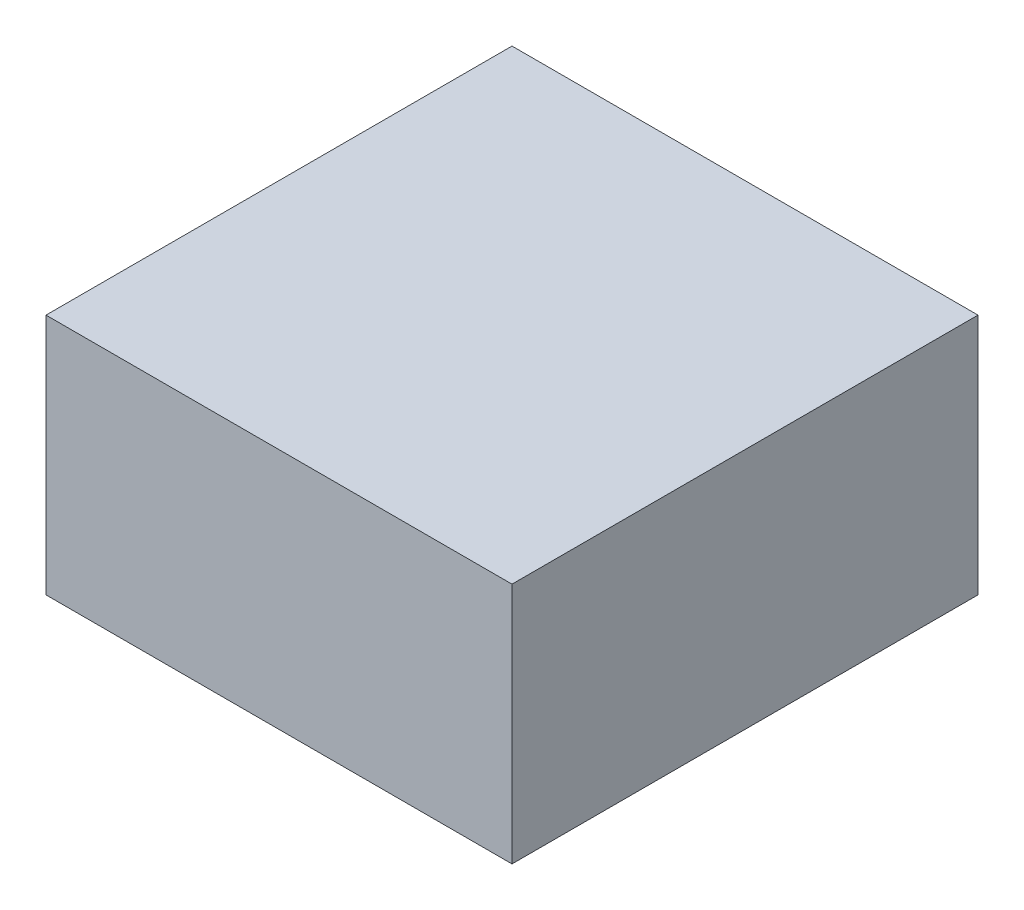
ISO-10303-21;
HEADER;
FILE_DESCRIPTION(('STEP AP214'),'2;1');
FILE_NAME('part.step','',(''),(''),'','','');
FILE_SCHEMA(('AUTOMOTIVE_DESIGN { 1 0 10303 214 1 1 1 1 }'));
ENDSEC;
DATA;
#1=APPLICATION_CONTEXT('core data for automotive mechanical design processes');
#2=APPLICATION_PROTOCOL_DEFINITION('international standard','automotive_design',2000,#1);
#3=PRODUCT_CONTEXT('',#1,'mechanical');
#4=PRODUCT('Part','Part','',(#3));
#5=PRODUCT_RELATED_PRODUCT_CATEGORY('part','',(#4));
#6=PRODUCT_DEFINITION_FORMATION('','',#4);
#7=PRODUCT_DEFINITION_CONTEXT('part definition',#1,'design');
#8=PRODUCT_DEFINITION('design','',#6,#7);
#9=PRODUCT_DEFINITION_SHAPE('','',#8);
#10=(LENGTH_UNIT() NAMED_UNIT(*) SI_UNIT(.MILLI.,.METRE.));
#11=(NAMED_UNIT(*) PLANE_ANGLE_UNIT() SI_UNIT($,.RADIAN.));
#12=(NAMED_UNIT(*) SI_UNIT($,.STERADIAN.) SOLID_ANGLE_UNIT());
#13=UNCERTAINTY_MEASURE_WITH_UNIT(LENGTH_MEASURE(1.E-05),#10,'distance_accuracy_value','');
#14=(GEOMETRIC_REPRESENTATION_CONTEXT(3) GLOBAL_UNCERTAINTY_ASSIGNED_CONTEXT((#13)) GLOBAL_UNIT_ASSIGNED_CONTEXT((#10,
#11,#12)) REPRESENTATION_CONTEXT('',''));
#15=CARTESIAN_POINT('',(0.,0.,0.));
#16=DIRECTION('',(0.,0.,1.));
#17=DIRECTION('',(1.,0.,0.));
#18=AXIS2_PLACEMENT_3D('',#15,#16,#17);
#19=CARTESIAN_POINT('',(-43.1841537046503,66.04,-81.7649472365053));
#20=DIRECTION('',(1.,0.,0.));
#21=DIRECTION('',(0.,0.,-1.));
#22=AXIS2_PLACEMENT_3D('',#19,#20,#21);
#23=PLANE('',#22);
#24=DIRECTION('',(0.,0.,1.));
#25=VECTOR('',#24,1.);
#26=CARTESIAN_POINT('',(-43.1841537046503,0.,-81.7649472365053));
#27=LINE('',#26,#25);
#28=CARTESIAN_POINT('',(-43.1841537046503,0.,-81.7649472365053));
#29=VERTEX_POINT('',#28);
#30=CARTESIAN_POINT('',(-43.1841537046503,0.,45.2350527634947));
#31=VERTEX_POINT('',#30);
#32=EDGE_CURVE('E100',#29,#31,#27,.T.);
#33=ORIENTED_EDGE('',*,*,#32,.T.);
#34=DIRECTION('',(0.,-1.,0.));
#35=VECTOR('',#34,1.);
#36=CARTESIAN_POINT('',(-43.1841537046503,66.04,45.2350527634947));
#37=LINE('',#36,#35);
#38=CARTESIAN_POINT('',(-43.1841537046503,66.04,45.2350527634947));
#39=VERTEX_POINT('',#38);
#40=EDGE_CURVE('E11',#39,#31,#37,.T.);
#41=ORIENTED_EDGE('',*,*,#40,.F.);
#42=DIRECTION('',(0.,0.,1.));
#43=VECTOR('',#42,1.);
#44=CARTESIAN_POINT('',(-43.1841537046503,66.04,-81.7649472365053));
#45=LINE('',#44,#43);
#46=CARTESIAN_POINT('',(-43.1841537046503,66.04,-81.7649472365053));
#47=VERTEX_POINT('',#46);
#48=EDGE_CURVE('E88',#47,#39,#45,.T.);
#49=ORIENTED_EDGE('',*,*,#48,.F.);
#50=DIRECTION('',(0.,-1.,0.));
#51=VECTOR('',#50,1.);
#52=CARTESIAN_POINT('',(-43.1841537046503,66.04,-81.7649472365053));
#53=LINE('',#52,#51);
#54=EDGE_CURVE('E96',#47,#29,#53,.T.);
#55=ORIENTED_EDGE('',*,*,#54,.T.);
#56=EDGE_LOOP('',(#33,#41,#49,#55));
#57=FACE_BOUND('',#56,.T.);
#58=ADVANCED_FACE('F37',(#57),#23,.F.);
#59=CARTESIAN_POINT('',(-43.1841537046503,66.04,45.2350527634947));
#60=DIRECTION('',(0.,0.,-1.));
#61=DIRECTION('',(-1.,0.,0.));
#62=AXIS2_PLACEMENT_3D('',#59,#60,#61);
#63=PLANE('',#62);
#64=DIRECTION('',(1.,0.,0.));
#65=VECTOR('',#64,1.);
#66=CARTESIAN_POINT('',(-43.1841537046503,0.,45.2350527634947));
#67=LINE('',#66,#65);
#68=CARTESIAN_POINT('',(83.8158462953497,0.,45.2350527634947));
#69=VERTEX_POINT('',#68);
#70=EDGE_CURVE('E92',#31,#69,#67,.T.);
#71=ORIENTED_EDGE('',*,*,#70,.T.);
#72=DIRECTION('',(0.,-1.,0.));
#73=VECTOR('',#72,1.);
#74=CARTESIAN_POINT('',(83.8158462953497,66.04,45.2350527634947));
#75=LINE('',#74,#73);
#76=CARTESIAN_POINT('',(83.8158462953497,66.04,45.2350527634947));
#77=VERTEX_POINT('',#76);
#78=EDGE_CURVE('E45',#77,#69,#75,.T.);
#79=ORIENTED_EDGE('',*,*,#78,.F.);
#80=DIRECTION('',(1.,0.,0.));
#81=VECTOR('',#80,1.);
#82=CARTESIAN_POINT('',(-43.1841537046503,66.04,45.2350527634947));
#83=LINE('',#82,#81);
#84=EDGE_CURVE('E83',#39,#77,#83,.T.);
#85=ORIENTED_EDGE('',*,*,#84,.F.);
#86=ORIENTED_EDGE('',*,*,#40,.T.);
#87=EDGE_LOOP('',(#71,#79,#85,#86));
#88=FACE_BOUND('',#87,.T.);
#89=ADVANCED_FACE('F91',(#88),#63,.F.);
#90=CARTESIAN_POINT('',(83.8158462953497,66.04,-81.7649472365053));
#91=DIRECTION('',(-1.,0.,0.));
#92=DIRECTION('',(0.,0.,1.));
#93=AXIS2_PLACEMENT_3D('',#90,#91,#92);
#94=PLANE('',#93);
#95=DIRECTION('',(0.,0.,-1.));
#96=VECTOR('',#95,1.);
#97=CARTESIAN_POINT('',(83.8158462953497,0.,-81.7649472365053));
#98=LINE('',#97,#96);
#99=CARTESIAN_POINT('',(83.8158462953497,0.,-81.7649472365053));
#100=VERTEX_POINT('',#99);
#101=EDGE_CURVE('E70',#69,#100,#98,.T.);
#102=ORIENTED_EDGE('',*,*,#101,.T.);
#103=DIRECTION('',(0.,-1.,0.));
#104=VECTOR('',#103,1.);
#105=CARTESIAN_POINT('',(83.8158462953497,66.04,-81.7649472365053));
#106=LINE('',#105,#104);
#107=CARTESIAN_POINT('',(83.8158462953497,66.04,-81.7649472365053));
#108=VERTEX_POINT('',#107);
#109=EDGE_CURVE('E93',#108,#100,#106,.T.);
#110=ORIENTED_EDGE('',*,*,#109,.F.);
#111=DIRECTION('',(0.,0.,-1.));
#112=VECTOR('',#111,1.);
#113=CARTESIAN_POINT('',(83.8158462953497,66.04,-81.7649472365053));
#114=LINE('',#113,#112);
#115=EDGE_CURVE('E86',#77,#108,#114,.T.);
#116=ORIENTED_EDGE('',*,*,#115,.F.);
#117=ORIENTED_EDGE('',*,*,#78,.T.);
#118=EDGE_LOOP('',(#102,#110,#116,#117));
#119=FACE_BOUND('',#118,.T.);
#120=ADVANCED_FACE('F94',(#119),#94,.F.);
#121=CARTESIAN_POINT('',(-43.1841537046503,66.04,-81.7649472365053));
#122=DIRECTION('',(0.,0.,1.));
#123=DIRECTION('',(1.,0.,0.));
#124=AXIS2_PLACEMENT_3D('',#121,#122,#123);
#125=PLANE('',#124);
#126=DIRECTION('',(-1.,0.,0.));
#127=VECTOR('',#126,1.);
#128=CARTESIAN_POINT('',(-43.1841537046503,0.,-81.7649472365053));
#129=LINE('',#128,#127);
#130=EDGE_CURVE('E76',#100,#29,#129,.T.);
#131=ORIENTED_EDGE('',*,*,#130,.T.);
#132=ORIENTED_EDGE('',*,*,#54,.F.);
#133=DIRECTION('',(-1.,0.,0.));
#134=VECTOR('',#133,1.);
#135=CARTESIAN_POINT('',(-43.1841537046503,66.04,-81.7649472365053));
#136=LINE('',#135,#134);
#137=EDGE_CURVE('E53',#108,#47,#136,.T.);
#138=ORIENTED_EDGE('',*,*,#137,.F.);
#139=ORIENTED_EDGE('',*,*,#109,.T.);
#140=EDGE_LOOP('',(#131,#132,#138,#139));
#141=FACE_BOUND('',#140,.T.);
#142=ADVANCED_FACE('F107',(#141),#125,.F.);
#143=CARTESIAN_POINT('',(0.,66.04,0.));
#144=DIRECTION('',(0.,1.,0.));
#145=DIRECTION('',(0.,0.,1.));
#146=AXIS2_PLACEMENT_3D('',#143,#144,#145);
#147=PLANE('',#146);
#148=ORIENTED_EDGE('',*,*,#48,.T.);
#149=ORIENTED_EDGE('',*,*,#84,.T.);
#150=ORIENTED_EDGE('',*,*,#115,.T.);
#151=ORIENTED_EDGE('',*,*,#137,.T.);
#152=EDGE_LOOP('',(#148,#149,#150,#151));
#153=FACE_BOUND('',#152,.T.);
#154=ADVANCED_FACE('F84',(#153),#147,.T.);
#155=CARTESIAN_POINT('',(0.,0.,0.));
#156=DIRECTION('',(0.,1.,0.));
#157=DIRECTION('',(0.,0.,1.));
#158=AXIS2_PLACEMENT_3D('',#155,#156,#157);
#159=PLANE('',#158);
#160=ORIENTED_EDGE('',*,*,#32,.F.);
#161=ORIENTED_EDGE('',*,*,#130,.F.);
#162=ORIENTED_EDGE('',*,*,#101,.F.);
#163=ORIENTED_EDGE('',*,*,#70,.F.);
#164=EDGE_LOOP('',(#160,#161,#162,#163));
#165=FACE_BOUND('',#164,.T.);
#166=ADVANCED_FACE('F110',(#165),#159,.F.);
#167=CLOSED_SHELL('',(#58,#89,#120,#142,#154,#166));
#168=MANIFOLD_SOLID_BREP('B2',#167);
#169=ADVANCED_BREP_SHAPE_REPRESENTATION('',(#18,#168),#14);
#170=SHAPE_DEFINITION_REPRESENTATION(#9,#169);
ENDSEC;
END-ISO-10303-21;
